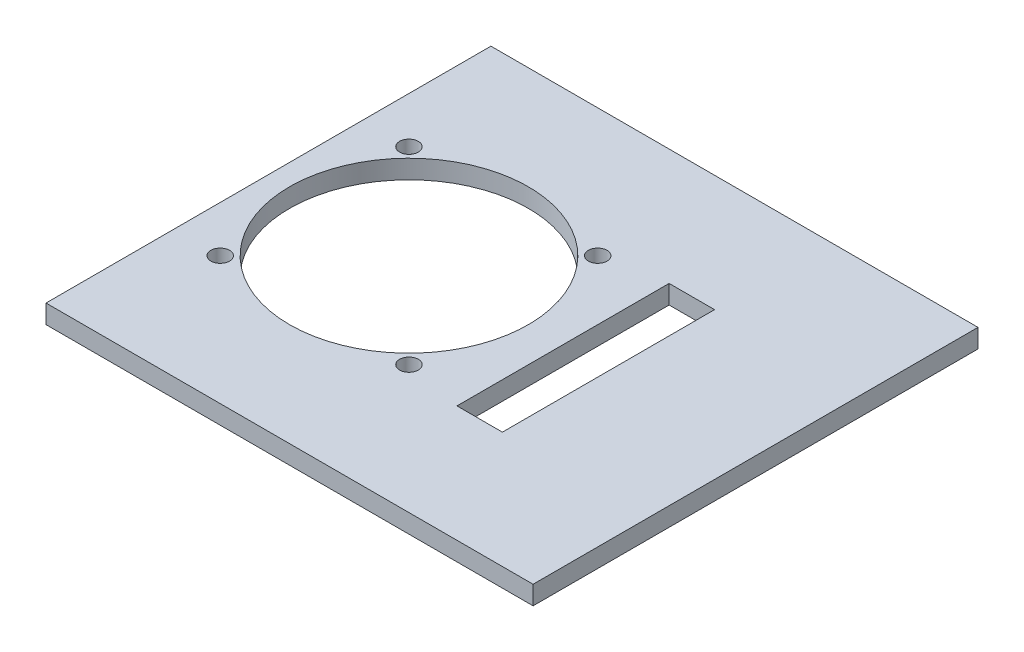
ISO-10303-21;
HEADER;
FILE_DESCRIPTION(('STEP AP214'),'2;1');
FILE_NAME('part.step','',(''),(''),'','','');
FILE_SCHEMA(('AUTOMOTIVE_DESIGN { 1 0 10303 214 1 1 1 1 }'));
ENDSEC;
DATA;
#1=APPLICATION_CONTEXT('core data for automotive mechanical design processes');
#2=APPLICATION_PROTOCOL_DEFINITION('international standard','automotive_design',2000,#1);
#3=PRODUCT_CONTEXT('',#1,'mechanical');
#4=PRODUCT('Part','Part','',(#3));
#5=PRODUCT_RELATED_PRODUCT_CATEGORY('part','',(#4));
#6=PRODUCT_DEFINITION_FORMATION('','',#4);
#7=PRODUCT_DEFINITION_CONTEXT('part definition',#1,'design');
#8=PRODUCT_DEFINITION('design','',#6,#7);
#9=PRODUCT_DEFINITION_SHAPE('','',#8);
#10=(LENGTH_UNIT() NAMED_UNIT(*) SI_UNIT(.MILLI.,.METRE.));
#11=(NAMED_UNIT(*) PLANE_ANGLE_UNIT() SI_UNIT($,.RADIAN.));
#12=(NAMED_UNIT(*) SI_UNIT($,.STERADIAN.) SOLID_ANGLE_UNIT());
#13=UNCERTAINTY_MEASURE_WITH_UNIT(LENGTH_MEASURE(1.E-05),#10,'distance_accuracy_value','');
#14=(GEOMETRIC_REPRESENTATION_CONTEXT(3) GLOBAL_UNCERTAINTY_ASSIGNED_CONTEXT((#13)) GLOBAL_UNIT_ASSIGNED_CONTEXT((#10,
#11,#12)) REPRESENTATION_CONTEXT('',''));
#15=CARTESIAN_POINT('',(0.,0.,0.));
#16=DIRECTION('',(0.,0.,1.));
#17=DIRECTION('',(1.,0.,0.));
#18=AXIS2_PLACEMENT_3D('',#15,#16,#17);
#19=CARTESIAN_POINT('',(0.,4.,0.));
#20=DIRECTION('',(0.,1.,0.));
#21=DIRECTION('',(0.,0.,1.));
#22=AXIS2_PLACEMENT_3D('',#19,#20,#21);
#23=PLANE('',#22);
#24=CARTESIAN_POINT('',(-9.22954277683082,4.,55.6861146496815));
#25=DIRECTION('',(0.,1.,0.));
#26=DIRECTION('',(0.,0.,1.));
#27=AXIS2_PLACEMENT_3D('',#24,#25,#26);
#28=CIRCLE('',#27,2.);
#29=CARTESIAN_POINT('',(-9.22954277683082,4.,57.6861146496815));
#30=VERTEX_POINT('',#29);
#31=EDGE_CURVE('E281',#30,#30,#28,.T.);
#32=ORIENTED_EDGE('',*,*,#31,.F.);
#33=EDGE_LOOP('',(#32));
#34=FACE_BOUND('',#33,.T.);
#35=CARTESIAN_POINT('',(-9.22954277683082,4.,15.3861146496815));
#36=DIRECTION('',(0.,1.,0.));
#37=DIRECTION('',(0.,0.,1.));
#38=AXIS2_PLACEMENT_3D('',#35,#36,#37);
#39=CIRCLE('',#38,2.);
#40=CARTESIAN_POINT('',(-9.22954277683082,4.,17.3861146496815));
#41=VERTEX_POINT('',#40);
#42=EDGE_CURVE('E297',#41,#41,#39,.T.);
#43=ORIENTED_EDGE('',*,*,#42,.F.);
#44=EDGE_LOOP('',(#43));
#45=FACE_BOUND('',#44,.T.);
#46=DIRECTION('',(1.,0.,0.));
#47=VECTOR('',#46,1.);
#48=CARTESIAN_POINT('',(43.8204572231692,4.,58.1861146496815));
#49=LINE('',#48,#47);
#50=CARTESIAN_POINT('',(43.8204572231692,4.,58.1861146496815));
#51=VERTEX_POINT('',#50);
#52=CARTESIAN_POINT('',(53.5204572231692,4.,58.1861146496815));
#53=VERTEX_POINT('',#52);
#54=EDGE_CURVE('E114',#51,#53,#49,.T.);
#55=ORIENTED_EDGE('',*,*,#54,.F.);
#56=DIRECTION('',(0.,0.,1.));
#57=VECTOR('',#56,1.);
#58=CARTESIAN_POINT('',(43.8204572231692,4.,12.8861146496815));
#59=LINE('',#58,#57);
#60=CARTESIAN_POINT('',(43.8204572231692,4.,12.8861146496815));
#61=VERTEX_POINT('',#60);
#62=EDGE_CURVE('E105',#61,#51,#59,.T.);
#63=ORIENTED_EDGE('',*,*,#62,.F.);
#64=DIRECTION('',(-1.,0.,0.));
#65=VECTOR('',#64,1.);
#66=CARTESIAN_POINT('',(43.8204572231692,4.,12.8861146496815));
#67=LINE('',#66,#65);
#68=CARTESIAN_POINT('',(53.5204572231692,4.,12.8861146496815));
#69=VERTEX_POINT('',#68);
#70=EDGE_CURVE('E132',#69,#61,#67,.T.);
#71=ORIENTED_EDGE('',*,*,#70,.F.);
#72=DIRECTION('',(0.,0.,-1.));
#73=VECTOR('',#72,1.);
#74=CARTESIAN_POINT('',(53.5204572231692,4.,12.8861146496815));
#75=LINE('',#74,#73);
#76=EDGE_CURVE('E128',#53,#69,#75,.T.);
#77=ORIENTED_EDGE('',*,*,#76,.F.);
#78=EDGE_LOOP('',(#55,#63,#71,#77));
#79=FACE_BOUND('',#78,.T.);
#80=DIRECTION('',(0.,0.,1.));
#81=VECTOR('',#80,1.);
#82=CARTESIAN_POINT('',(-19.0795427768308,4.,-11.9638853503185));
#83=LINE('',#82,#81);
#84=CARTESIAN_POINT('',(-19.0795427768308,4.,-11.9638853503185));
#85=VERTEX_POINT('',#84);
#86=CARTESIAN_POINT('',(-19.0795427768308,4.,83.0361146496815));
#87=VERTEX_POINT('',#86);
#88=EDGE_CURVE('E156',#85,#87,#83,.T.);
#89=ORIENTED_EDGE('',*,*,#88,.T.);
#90=DIRECTION('',(1.,0.,0.));
#91=VECTOR('',#90,1.);
#92=CARTESIAN_POINT('',(-19.0795427768308,4.,83.0361146496815));
#93=LINE('',#92,#91);
#94=CARTESIAN_POINT('',(84.9204572231692,4.,83.0361146496815));
#95=VERTEX_POINT('',#94);
#96=EDGE_CURVE('E160',#87,#95,#93,.T.);
#97=ORIENTED_EDGE('',*,*,#96,.T.);
#98=DIRECTION('',(0.,0.,-1.));
#99=VECTOR('',#98,1.);
#100=CARTESIAN_POINT('',(84.9204572231692,4.,-11.9638853503185));
#101=LINE('',#100,#99);
#102=CARTESIAN_POINT('',(84.9204572231692,4.,-11.9638853503185));
#103=VERTEX_POINT('',#102);
#104=EDGE_CURVE('E164',#95,#103,#101,.T.);
#105=ORIENTED_EDGE('',*,*,#104,.T.);
#106=DIRECTION('',(-1.,0.,0.));
#107=VECTOR('',#106,1.);
#108=CARTESIAN_POINT('',(-19.0795427768308,4.,-11.9638853503185));
#109=LINE('',#108,#107);
#110=EDGE_CURVE('E167',#103,#85,#109,.T.);
#111=ORIENTED_EDGE('',*,*,#110,.T.);
#112=EDGE_LOOP('',(#89,#97,#105,#111));
#113=FACE_BOUND('',#112,.T.);
#114=CARTESIAN_POINT('',(10.9204572231692,4.,35.5361146496815));
#115=DIRECTION('',(0.,1.,0.));
#116=DIRECTION('',(0.,0.,1.));
#117=AXIS2_PLACEMENT_3D('',#114,#115,#116);
#118=CIRCLE('',#117,25.5);
#119=CARTESIAN_POINT('',(10.9204572231692,4.,61.0361146496815));
#120=VERTEX_POINT('',#119);
#121=EDGE_CURVE('E140',#120,#120,#118,.T.);
#122=ORIENTED_EDGE('',*,*,#121,.F.);
#123=EDGE_LOOP('',(#122));
#124=FACE_BOUND('',#123,.T.);
#125=CARTESIAN_POINT('',(31.0704572231692,4.,55.6861146496815));
#126=DIRECTION('',(0.,1.,0.));
#127=DIRECTION('',(0.,0.,1.));
#128=AXIS2_PLACEMENT_3D('',#125,#126,#127);
#129=CIRCLE('',#128,2.);
#130=CARTESIAN_POINT('',(31.0704572231692,4.,57.6861146496815));
#131=VERTEX_POINT('',#130);
#132=EDGE_CURVE('E289',#131,#131,#129,.T.);
#133=ORIENTED_EDGE('',*,*,#132,.F.);
#134=EDGE_LOOP('',(#133));
#135=FACE_BOUND('',#134,.T.);
#136=CARTESIAN_POINT('',(31.0704572231692,4.,15.3861146496815));
#137=DIRECTION('',(0.,1.,0.));
#138=DIRECTION('',(0.,0.,1.));
#139=AXIS2_PLACEMENT_3D('',#136,#137,#138);
#140=CIRCLE('',#139,2.);
#141=CARTESIAN_POINT('',(31.0704572231692,4.,17.3861146496815));
#142=VERTEX_POINT('',#141);
#143=EDGE_CURVE('E270',#142,#142,#140,.T.);
#144=ORIENTED_EDGE('',*,*,#143,.F.);
#145=EDGE_LOOP('',(#144));
#146=FACE_BOUND('',#145,.T.);
#147=ADVANCED_FACE('F39',(#34,#45,#79,#113,#124,#135,#146),#23,.T.);
#148=CARTESIAN_POINT('',(0.,0.,0.));
#149=DIRECTION('',(0.,1.,0.));
#150=DIRECTION('',(0.,0.,1.));
#151=AXIS2_PLACEMENT_3D('',#148,#149,#150);
#152=PLANE('',#151);
#153=DIRECTION('',(0.,0.,1.));
#154=VECTOR('',#153,1.);
#155=CARTESIAN_POINT('',(-19.0795427768308,0.,-11.9638853503185));
#156=LINE('',#155,#154);
#157=CARTESIAN_POINT('',(-19.0795427768308,0.,-11.9638853503185));
#158=VERTEX_POINT('',#157);
#159=CARTESIAN_POINT('',(-19.0795427768308,0.,83.0361146496815));
#160=VERTEX_POINT('',#159);
#161=EDGE_CURVE('E123',#158,#160,#156,.T.);
#162=ORIENTED_EDGE('',*,*,#161,.F.);
#163=DIRECTION('',(-1.,0.,0.));
#164=VECTOR('',#163,1.);
#165=CARTESIAN_POINT('',(-19.0795427768308,0.,-11.9638853503185));
#166=LINE('',#165,#164);
#167=CARTESIAN_POINT('',(84.9204572231692,0.,-11.9638853503185));
#168=VERTEX_POINT('',#167);
#169=EDGE_CURVE('E161',#168,#158,#166,.T.);
#170=ORIENTED_EDGE('',*,*,#169,.F.);
#171=DIRECTION('',(0.,0.,-1.));
#172=VECTOR('',#171,1.);
#173=CARTESIAN_POINT('',(84.9204572231692,0.,-11.9638853503185));
#174=LINE('',#173,#172);
#175=CARTESIAN_POINT('',(84.9204572231692,0.,83.0361146496815));
#176=VERTEX_POINT('',#175);
#177=EDGE_CURVE('E177',#176,#168,#174,.T.);
#178=ORIENTED_EDGE('',*,*,#177,.F.);
#179=DIRECTION('',(1.,0.,0.));
#180=VECTOR('',#179,1.);
#181=CARTESIAN_POINT('',(-19.0795427768308,0.,83.0361146496815));
#182=LINE('',#181,#180);
#183=EDGE_CURVE('E174',#160,#176,#182,.T.);
#184=ORIENTED_EDGE('',*,*,#183,.F.);
#185=EDGE_LOOP('',(#162,#170,#178,#184));
#186=FACE_BOUND('',#185,.T.);
#187=DIRECTION('',(0.,0.,1.));
#188=VECTOR('',#187,1.);
#189=CARTESIAN_POINT('',(43.8204572231692,0.,12.8861146496815));
#190=LINE('',#189,#188);
#191=CARTESIAN_POINT('',(43.8204572231692,0.,12.8861146496815));
#192=VERTEX_POINT('',#191);
#193=CARTESIAN_POINT('',(43.8204572231692,0.,58.1861146496815));
#194=VERTEX_POINT('',#193);
#195=EDGE_CURVE('E63',#192,#194,#190,.T.);
#196=ORIENTED_EDGE('',*,*,#195,.T.);
#197=DIRECTION('',(1.,0.,0.));
#198=VECTOR('',#197,1.);
#199=CARTESIAN_POINT('',(43.8204572231692,0.,58.1861146496815));
#200=LINE('',#199,#198);
#201=CARTESIAN_POINT('',(53.5204572231692,0.,58.1861146496815));
#202=VERTEX_POINT('',#201);
#203=EDGE_CURVE('E121',#194,#202,#200,.T.);
#204=ORIENTED_EDGE('',*,*,#203,.T.);
#205=DIRECTION('',(0.,0.,-1.));
#206=VECTOR('',#205,1.);
#207=CARTESIAN_POINT('',(53.5204572231692,0.,12.8861146496815));
#208=LINE('',#207,#206);
#209=CARTESIAN_POINT('',(53.5204572231692,0.,12.8861146496815));
#210=VERTEX_POINT('',#209);
#211=EDGE_CURVE('E143',#202,#210,#208,.T.);
#212=ORIENTED_EDGE('',*,*,#211,.T.);
#213=DIRECTION('',(-1.,0.,0.));
#214=VECTOR('',#213,1.);
#215=CARTESIAN_POINT('',(43.8204572231692,0.,12.8861146496815));
#216=LINE('',#215,#214);
#217=EDGE_CURVE('E115',#210,#192,#216,.T.);
#218=ORIENTED_EDGE('',*,*,#217,.T.);
#219=EDGE_LOOP('',(#196,#204,#212,#218));
#220=FACE_BOUND('',#219,.T.);
#221=CARTESIAN_POINT('',(10.9204572231692,0.,35.5361146496815));
#222=DIRECTION('',(0.,1.,0.));
#223=DIRECTION('',(0.,0.,1.));
#224=AXIS2_PLACEMENT_3D('',#221,#222,#223);
#225=CIRCLE('',#224,25.5);
#226=CARTESIAN_POINT('',(10.9204572231692,0.,61.0361146496815));
#227=VERTEX_POINT('',#226);
#228=EDGE_CURVE('E301',#227,#227,#225,.T.);
#229=ORIENTED_EDGE('',*,*,#228,.T.);
#230=EDGE_LOOP('',(#229));
#231=FACE_BOUND('',#230,.T.);
#232=CARTESIAN_POINT('',(-9.22954277683082,0.,15.3861146496815));
#233=DIRECTION('',(0.,1.,0.));
#234=DIRECTION('',(0.,0.,1.));
#235=AXIS2_PLACEMENT_3D('',#232,#233,#234);
#236=CIRCLE('',#235,2.);
#237=CARTESIAN_POINT('',(-9.22954277683082,0.,17.3861146496815));
#238=VERTEX_POINT('',#237);
#239=EDGE_CURVE('E293',#238,#238,#236,.T.);
#240=ORIENTED_EDGE('',*,*,#239,.T.);
#241=EDGE_LOOP('',(#240));
#242=FACE_BOUND('',#241,.T.);
#243=CARTESIAN_POINT('',(31.0704572231692,0.,55.6861146496815));
#244=DIRECTION('',(0.,1.,0.));
#245=DIRECTION('',(0.,0.,1.));
#246=AXIS2_PLACEMENT_3D('',#243,#244,#245);
#247=CIRCLE('',#246,2.);
#248=CARTESIAN_POINT('',(31.0704572231692,0.,57.6861146496815));
#249=VERTEX_POINT('',#248);
#250=EDGE_CURVE('E285',#249,#249,#247,.T.);
#251=ORIENTED_EDGE('',*,*,#250,.T.);
#252=EDGE_LOOP('',(#251));
#253=FACE_BOUND('',#252,.T.);
#254=CARTESIAN_POINT('',(-9.22954277683082,0.,55.6861146496815));
#255=DIRECTION('',(0.,1.,0.));
#256=DIRECTION('',(0.,0.,1.));
#257=AXIS2_PLACEMENT_3D('',#254,#255,#256);
#258=CIRCLE('',#257,2.);
#259=CARTESIAN_POINT('',(-9.22954277683082,0.,57.6861146496815));
#260=VERTEX_POINT('',#259);
#261=EDGE_CURVE('E278',#260,#260,#258,.T.);
#262=ORIENTED_EDGE('',*,*,#261,.T.);
#263=EDGE_LOOP('',(#262));
#264=FACE_BOUND('',#263,.T.);
#265=CARTESIAN_POINT('',(31.0704572231692,0.,15.3861146496815));
#266=DIRECTION('',(0.,1.,0.));
#267=DIRECTION('',(0.,0.,1.));
#268=AXIS2_PLACEMENT_3D('',#265,#266,#267);
#269=CIRCLE('',#268,2.);
#270=CARTESIAN_POINT('',(31.0704572231692,0.,17.3861146496815));
#271=VERTEX_POINT('',#270);
#272=EDGE_CURVE('E273',#271,#271,#269,.T.);
#273=ORIENTED_EDGE('',*,*,#272,.T.);
#274=EDGE_LOOP('',(#273));
#275=FACE_BOUND('',#274,.T.);
#276=ADVANCED_FACE('F200',(#186,#220,#231,#242,#253,#264,#275),#152,.F.);
#277=CARTESIAN_POINT('',(-19.0795427768308,4.,-11.9638853503185));
#278=DIRECTION('',(1.,0.,0.));
#279=DIRECTION('',(0.,0.,-1.));
#280=AXIS2_PLACEMENT_3D('',#277,#278,#279);
#281=PLANE('',#280);
#282=ORIENTED_EDGE('',*,*,#161,.T.);
#283=DIRECTION('',(0.,-1.,0.));
#284=VECTOR('',#283,1.);
#285=CARTESIAN_POINT('',(-19.0795427768308,4.,83.0361146496815));
#286=LINE('',#285,#284);
#287=EDGE_CURVE('E11',#87,#160,#286,.T.);
#288=ORIENTED_EDGE('',*,*,#287,.F.);
#289=ORIENTED_EDGE('',*,*,#88,.F.);
#290=DIRECTION('',(0.,-1.,0.));
#291=VECTOR('',#290,1.);
#292=CARTESIAN_POINT('',(-19.0795427768308,4.,-11.9638853503185));
#293=LINE('',#292,#291);
#294=EDGE_CURVE('E170',#85,#158,#293,.T.);
#295=ORIENTED_EDGE('',*,*,#294,.T.);
#296=EDGE_LOOP('',(#282,#288,#289,#295));
#297=FACE_BOUND('',#296,.T.);
#298=ADVANCED_FACE('F41',(#297),#281,.F.);
#299=CARTESIAN_POINT('',(-19.0795427768308,4.,83.0361146496815));
#300=DIRECTION('',(0.,0.,-1.));
#301=DIRECTION('',(-1.,0.,0.));
#302=AXIS2_PLACEMENT_3D('',#299,#300,#301);
#303=PLANE('',#302);
#304=ORIENTED_EDGE('',*,*,#183,.T.);
#305=DIRECTION('',(0.,-1.,0.));
#306=VECTOR('',#305,1.);
#307=CARTESIAN_POINT('',(84.9204572231692,4.,83.0361146496815));
#308=LINE('',#307,#306);
#309=EDGE_CURVE('E48',#95,#176,#308,.T.);
#310=ORIENTED_EDGE('',*,*,#309,.F.);
#311=ORIENTED_EDGE('',*,*,#96,.F.);
#312=ORIENTED_EDGE('',*,*,#287,.T.);
#313=EDGE_LOOP('',(#304,#310,#311,#312));
#314=FACE_BOUND('',#313,.T.);
#315=ADVANCED_FACE('F210',(#314),#303,.F.);
#316=CARTESIAN_POINT('',(84.9204572231692,4.,-11.9638853503185));
#317=DIRECTION('',(-1.,0.,0.));
#318=DIRECTION('',(0.,0.,1.));
#319=AXIS2_PLACEMENT_3D('',#316,#317,#318);
#320=PLANE('',#319);
#321=ORIENTED_EDGE('',*,*,#177,.T.);
#322=DIRECTION('',(0.,-1.,0.));
#323=VECTOR('',#322,1.);
#324=CARTESIAN_POINT('',(84.9204572231692,4.,-11.9638853503185));
#325=LINE('',#324,#323);
#326=EDGE_CURVE('E185',#103,#168,#325,.T.);
#327=ORIENTED_EDGE('',*,*,#326,.F.);
#328=ORIENTED_EDGE('',*,*,#104,.F.);
#329=ORIENTED_EDGE('',*,*,#309,.T.);
#330=EDGE_LOOP('',(#321,#327,#328,#329));
#331=FACE_BOUND('',#330,.T.);
#332=ADVANCED_FACE('F194',(#331),#320,.F.);
#333=CARTESIAN_POINT('',(-19.0795427768308,4.,-11.9638853503185));
#334=DIRECTION('',(0.,0.,1.));
#335=DIRECTION('',(1.,0.,0.));
#336=AXIS2_PLACEMENT_3D('',#333,#334,#335);
#337=PLANE('',#336);
#338=ORIENTED_EDGE('',*,*,#169,.T.);
#339=ORIENTED_EDGE('',*,*,#294,.F.);
#340=ORIENTED_EDGE('',*,*,#110,.F.);
#341=ORIENTED_EDGE('',*,*,#326,.T.);
#342=EDGE_LOOP('',(#338,#339,#340,#341));
#343=FACE_BOUND('',#342,.T.);
#344=ADVANCED_FACE('F204',(#343),#337,.F.);
#345=CARTESIAN_POINT('',(43.8204572231692,4.,12.8861146496815));
#346=DIRECTION('',(1.,0.,0.));
#347=DIRECTION('',(0.,0.,-1.));
#348=AXIS2_PLACEMENT_3D('',#345,#346,#347);
#349=PLANE('',#348);
#350=ORIENTED_EDGE('',*,*,#195,.F.);
#351=DIRECTION('',(0.,-1.,0.));
#352=VECTOR('',#351,1.);
#353=CARTESIAN_POINT('',(43.8204572231692,4.,12.8861146496815));
#354=LINE('',#353,#352);
#355=EDGE_CURVE('E109',#61,#192,#354,.T.);
#356=ORIENTED_EDGE('',*,*,#355,.F.);
#357=ORIENTED_EDGE('',*,*,#62,.T.);
#358=DIRECTION('',(0.,-1.,0.));
#359=VECTOR('',#358,1.);
#360=CARTESIAN_POINT('',(43.8204572231692,4.,58.1861146496815));
#361=LINE('',#360,#359);
#362=EDGE_CURVE('E108',#51,#194,#361,.T.);
#363=ORIENTED_EDGE('',*,*,#362,.T.);
#364=EDGE_LOOP('',(#350,#356,#357,#363));
#365=FACE_BOUND('',#364,.T.);
#366=ADVANCED_FACE('F107',(#365),#349,.T.);
#367=CARTESIAN_POINT('',(43.8204572231692,4.,58.1861146496815));
#368=DIRECTION('',(0.,0.,-1.));
#369=DIRECTION('',(-1.,0.,0.));
#370=AXIS2_PLACEMENT_3D('',#367,#368,#369);
#371=PLANE('',#370);
#372=ORIENTED_EDGE('',*,*,#203,.F.);
#373=ORIENTED_EDGE('',*,*,#362,.F.);
#374=ORIENTED_EDGE('',*,*,#54,.T.);
#375=DIRECTION('',(0.,-1.,0.));
#376=VECTOR('',#375,1.);
#377=CARTESIAN_POINT('',(53.5204572231692,4.,58.1861146496815));
#378=LINE('',#377,#376);
#379=EDGE_CURVE('E124',#53,#202,#378,.T.);
#380=ORIENTED_EDGE('',*,*,#379,.T.);
#381=EDGE_LOOP('',(#372,#373,#374,#380));
#382=FACE_BOUND('',#381,.T.);
#383=ADVANCED_FACE('F118',(#382),#371,.T.);
#384=CARTESIAN_POINT('',(53.5204572231692,4.,12.8861146496815));
#385=DIRECTION('',(-1.,0.,0.));
#386=DIRECTION('',(0.,0.,1.));
#387=AXIS2_PLACEMENT_3D('',#384,#385,#386);
#388=PLANE('',#387);
#389=ORIENTED_EDGE('',*,*,#211,.F.);
#390=ORIENTED_EDGE('',*,*,#379,.F.);
#391=ORIENTED_EDGE('',*,*,#76,.T.);
#392=DIRECTION('',(0.,-1.,0.));
#393=VECTOR('',#392,1.);
#394=CARTESIAN_POINT('',(53.5204572231692,4.,12.8861146496815));
#395=LINE('',#394,#393);
#396=EDGE_CURVE('E55',#69,#210,#395,.T.);
#397=ORIENTED_EDGE('',*,*,#396,.T.);
#398=EDGE_LOOP('',(#389,#390,#391,#397));
#399=FACE_BOUND('',#398,.T.);
#400=ADVANCED_FACE('F236',(#399),#388,.T.);
#401=CARTESIAN_POINT('',(43.8204572231692,4.,12.8861146496815));
#402=DIRECTION('',(0.,0.,1.));
#403=DIRECTION('',(1.,0.,0.));
#404=AXIS2_PLACEMENT_3D('',#401,#402,#403);
#405=PLANE('',#404);
#406=ORIENTED_EDGE('',*,*,#217,.F.);
#407=ORIENTED_EDGE('',*,*,#396,.F.);
#408=ORIENTED_EDGE('',*,*,#70,.T.);
#409=ORIENTED_EDGE('',*,*,#355,.T.);
#410=EDGE_LOOP('',(#406,#407,#408,#409));
#411=FACE_BOUND('',#410,.T.);
#412=ADVANCED_FACE('F240',(#411),#405,.T.);
#413=CARTESIAN_POINT('',(10.9204572231692,4.,35.5361146496815));
#414=DIRECTION('',(0.,-1.,0.));
#415=DIRECTION('',(0.,0.,-1.));
#416=AXIS2_PLACEMENT_3D('',#413,#414,#415);
#417=CYLINDRICAL_SURFACE('',#416,25.5);
#418=ORIENTED_EDGE('',*,*,#121,.T.);
#419=EDGE_LOOP('',(#418));
#420=FACE_BOUND('',#419,.T.);
#421=ORIENTED_EDGE('',*,*,#228,.F.);
#422=EDGE_LOOP('',(#421));
#423=FACE_BOUND('',#422,.T.);
#424=ADVANCED_FACE('F246',(#420,#423),#417,.F.);
#425=CARTESIAN_POINT('',(-9.22954277683082,4.,15.3861146496815));
#426=DIRECTION('',(0.,-1.,0.));
#427=DIRECTION('',(0.,0.,-1.));
#428=AXIS2_PLACEMENT_3D('',#425,#426,#427);
#429=CYLINDRICAL_SURFACE('',#428,2.);
#430=ORIENTED_EDGE('',*,*,#42,.T.);
#431=EDGE_LOOP('',(#430));
#432=FACE_BOUND('',#431,.T.);
#433=ORIENTED_EDGE('',*,*,#239,.F.);
#434=EDGE_LOOP('',(#433));
#435=FACE_BOUND('',#434,.T.);
#436=ADVANCED_FACE('F249',(#432,#435),#429,.F.);
#437=CARTESIAN_POINT('',(31.0704572231692,4.,55.6861146496815));
#438=DIRECTION('',(0.,-1.,0.));
#439=DIRECTION('',(0.,0.,-1.));
#440=AXIS2_PLACEMENT_3D('',#437,#438,#439);
#441=CYLINDRICAL_SURFACE('',#440,2.);
#442=ORIENTED_EDGE('',*,*,#132,.T.);
#443=EDGE_LOOP('',(#442));
#444=FACE_BOUND('',#443,.T.);
#445=ORIENTED_EDGE('',*,*,#250,.F.);
#446=EDGE_LOOP('',(#445));
#447=FACE_BOUND('',#446,.T.);
#448=ADVANCED_FACE('F253',(#444,#447),#441,.F.);
#449=CARTESIAN_POINT('',(-9.22954277683082,4.,55.6861146496815));
#450=DIRECTION('',(0.,-1.,0.));
#451=DIRECTION('',(0.,0.,-1.));
#452=AXIS2_PLACEMENT_3D('',#449,#450,#451);
#453=CYLINDRICAL_SURFACE('',#452,2.);
#454=ORIENTED_EDGE('',*,*,#31,.T.);
#455=EDGE_LOOP('',(#454));
#456=FACE_BOUND('',#455,.T.);
#457=ORIENTED_EDGE('',*,*,#261,.F.);
#458=EDGE_LOOP('',(#457));
#459=FACE_BOUND('',#458,.T.);
#460=ADVANCED_FACE('F257',(#456,#459),#453,.F.);
#461=CARTESIAN_POINT('',(31.0704572231692,4.,15.3861146496815));
#462=DIRECTION('',(0.,-1.,0.));
#463=DIRECTION('',(0.,0.,-1.));
#464=AXIS2_PLACEMENT_3D('',#461,#462,#463);
#465=CYLINDRICAL_SURFACE('',#464,2.);
#466=ORIENTED_EDGE('',*,*,#143,.T.);
#467=EDGE_LOOP('',(#466));
#468=FACE_BOUND('',#467,.T.);
#469=ORIENTED_EDGE('',*,*,#272,.F.);
#470=EDGE_LOOP('',(#469));
#471=FACE_BOUND('',#470,.T.);
#472=ADVANCED_FACE('F261',(#468,#471),#465,.F.);
#473=CLOSED_SHELL('',(#147,#276,#298,#315,#332,#344,#366,#383,#400,#412,#424,#436,#448,#460,#472));
#474=MANIFOLD_SOLID_BREP('B2',#473);
#475=ADVANCED_BREP_SHAPE_REPRESENTATION('',(#18,#474),#14);
#476=SHAPE_DEFINITION_REPRESENTATION(#9,#475);
ENDSEC;
END-ISO-10303-21;
